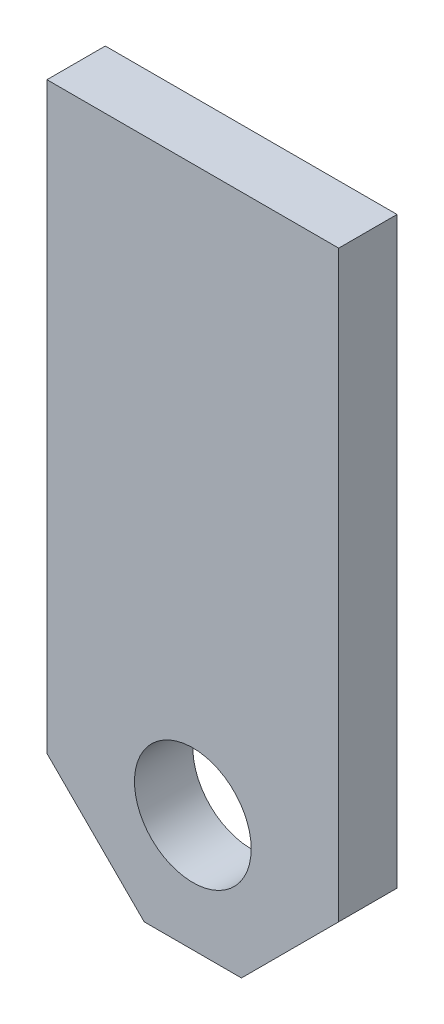
ISO-10303-21;
HEADER;
FILE_DESCRIPTION(('STEP AP214'),'2;1');
FILE_NAME('part.step','',(''),(''),'','','');
FILE_SCHEMA(('AUTOMOTIVE_DESIGN { 1 0 10303 214 1 1 1 1 }'));
ENDSEC;
DATA;
#1=APPLICATION_CONTEXT('core data for automotive mechanical design processes');
#2=APPLICATION_PROTOCOL_DEFINITION('international standard','automotive_design',2000,#1);
#3=PRODUCT_CONTEXT('',#1,'mechanical');
#4=PRODUCT('Part','Part','',(#3));
#5=PRODUCT_RELATED_PRODUCT_CATEGORY('part','',(#4));
#6=PRODUCT_DEFINITION_FORMATION('','',#4);
#7=PRODUCT_DEFINITION_CONTEXT('part definition',#1,'design');
#8=PRODUCT_DEFINITION('design','',#6,#7);
#9=PRODUCT_DEFINITION_SHAPE('','',#8);
#10=(LENGTH_UNIT() NAMED_UNIT(*) SI_UNIT(.MILLI.,.METRE.));
#11=(NAMED_UNIT(*) PLANE_ANGLE_UNIT() SI_UNIT($,.RADIAN.));
#12=(NAMED_UNIT(*) SI_UNIT($,.STERADIAN.) SOLID_ANGLE_UNIT());
#13=UNCERTAINTY_MEASURE_WITH_UNIT(LENGTH_MEASURE(1.E-05),#10,'distance_accuracy_value','');
#14=(GEOMETRIC_REPRESENTATION_CONTEXT(3) GLOBAL_UNCERTAINTY_ASSIGNED_CONTEXT((#13)) GLOBAL_UNIT_ASSIGNED_CONTEXT((#10,
#11,#12)) REPRESENTATION_CONTEXT('',''));
#15=CARTESIAN_POINT('',(0.,0.,0.));
#16=DIRECTION('',(0.,0.,1.));
#17=DIRECTION('',(1.,0.,0.));
#18=AXIS2_PLACEMENT_3D('',#15,#16,#17);
#19=CARTESIAN_POINT('',(-15.,0.,6.00000000000001));
#20=DIRECTION('',(-1.,0.,0.));
#21=DIRECTION('',(0.,-1.,0.));
#22=AXIS2_PLACEMENT_3D('',#19,#20,#21);
#23=PLANE('',#22);
#24=DIRECTION('',(0.,-1.,0.));
#25=VECTOR('',#24,1.);
#26=CARTESIAN_POINT('',(-15.,0.,6.00000000000001));
#27=LINE('',#26,#25);
#28=CARTESIAN_POINT('',(-15.,0.,6.00000000000001));
#29=VERTEX_POINT('',#28);
#30=CARTESIAN_POINT('',(-15.,-60.,6.00000000000001));
#31=VERTEX_POINT('',#30);
#32=EDGE_CURVE('E119',#29,#31,#27,.T.);
#33=ORIENTED_EDGE('',*,*,#32,.F.);
#34=DIRECTION('',(0.,0.,-1.));
#35=VECTOR('',#34,1.);
#36=CARTESIAN_POINT('',(-15.,0.,6.00000000000001));
#37=LINE('',#36,#35);
#38=CARTESIAN_POINT('',(-15.,0.,0.));
#39=VERTEX_POINT('',#38);
#40=EDGE_CURVE('E101',#29,#39,#37,.T.);
#41=ORIENTED_EDGE('',*,*,#40,.T.);
#42=DIRECTION('',(0.,-1.,0.));
#43=VECTOR('',#42,1.);
#44=CARTESIAN_POINT('',(-15.,0.,0.));
#45=LINE('',#44,#43);
#46=CARTESIAN_POINT('',(-15.,-60.,0.));
#47=VERTEX_POINT('',#46);
#48=EDGE_CURVE('E109',#39,#47,#45,.T.);
#49=ORIENTED_EDGE('',*,*,#48,.T.);
#50=DIRECTION('',(0.,0.,-1.));
#51=VECTOR('',#50,1.);
#52=CARTESIAN_POINT('',(-15.,-60.,6.00000000000001));
#53=LINE('',#52,#51);
#54=EDGE_CURVE('E120',#31,#47,#53,.T.);
#55=ORIENTED_EDGE('',*,*,#54,.F.);
#56=EDGE_LOOP('',(#33,#41,#49,#55));
#57=FACE_BOUND('',#56,.T.);
#58=ADVANCED_FACE('F35',(#57),#23,.T.);
#59=CARTESIAN_POINT('',(-15.,0.,6.00000000000001));
#60=DIRECTION('',(0.,-1.,0.));
#61=DIRECTION('',(0.,0.,1.));
#62=AXIS2_PLACEMENT_3D('',#59,#60,#61);
#63=PLANE('',#62);
#64=DIRECTION('',(1.,0.,0.));
#65=VECTOR('',#64,1.);
#66=CARTESIAN_POINT('',(-15.,0.,0.));
#67=LINE('',#66,#65);
#68=CARTESIAN_POINT('',(15.,0.,0.));
#69=VERTEX_POINT('',#68);
#70=EDGE_CURVE('E117',#39,#69,#67,.T.);
#71=ORIENTED_EDGE('',*,*,#70,.F.);
#72=ORIENTED_EDGE('',*,*,#40,.F.);
#73=DIRECTION('',(1.,0.,0.));
#74=VECTOR('',#73,1.);
#75=CARTESIAN_POINT('',(-15.,0.,6.00000000000001));
#76=LINE('',#75,#74);
#77=CARTESIAN_POINT('',(15.,0.,6.00000000000001));
#78=VERTEX_POINT('',#77);
#79=EDGE_CURVE('E88',#29,#78,#76,.T.);
#80=ORIENTED_EDGE('',*,*,#79,.T.);
#81=DIRECTION('',(0.,0.,-1.));
#82=VECTOR('',#81,1.);
#83=CARTESIAN_POINT('',(15.,0.,6.00000000000001));
#84=LINE('',#83,#82);
#85=EDGE_CURVE('E95',#78,#69,#84,.T.);
#86=ORIENTED_EDGE('',*,*,#85,.T.);
#87=EDGE_LOOP('',(#71,#72,#80,#86));
#88=FACE_BOUND('',#87,.T.);
#89=ADVANCED_FACE('F103',(#88),#63,.F.);
#90=CARTESIAN_POINT('',(15.,0.,6.00000000000001));
#91=DIRECTION('',(-1.,0.,0.));
#92=DIRECTION('',(0.,-1.,0.));
#93=AXIS2_PLACEMENT_3D('',#90,#91,#92);
#94=PLANE('',#93);
#95=DIRECTION('',(0.,-1.,0.));
#96=VECTOR('',#95,1.);
#97=CARTESIAN_POINT('',(15.,0.,0.));
#98=LINE('',#97,#96);
#99=CARTESIAN_POINT('',(15.,-60.,0.));
#100=VERTEX_POINT('',#99);
#101=EDGE_CURVE('E98',#69,#100,#98,.T.);
#102=ORIENTED_EDGE('',*,*,#101,.F.);
#103=ORIENTED_EDGE('',*,*,#85,.F.);
#104=DIRECTION('',(0.,-1.,0.));
#105=VECTOR('',#104,1.);
#106=CARTESIAN_POINT('',(15.,0.,6.00000000000001));
#107=LINE('',#106,#105);
#108=CARTESIAN_POINT('',(15.,-60.,6.00000000000001));
#109=VERTEX_POINT('',#108);
#110=EDGE_CURVE('E83',#78,#109,#107,.T.);
#111=ORIENTED_EDGE('',*,*,#110,.T.);
#112=DIRECTION('',(0.,0.,1.));
#113=VECTOR('',#112,1.);
#114=CARTESIAN_POINT('',(15.,-60.,6.00000000000001));
#115=LINE('',#114,#113);
#116=EDGE_CURVE('E11',#100,#109,#115,.T.);
#117=ORIENTED_EDGE('',*,*,#116,.F.);
#118=EDGE_LOOP('',(#102,#103,#111,#117));
#119=FACE_BOUND('',#118,.T.);
#120=ADVANCED_FACE('F96',(#119),#94,.F.);
#121=CARTESIAN_POINT('',(-15.,-70.,6.00000000000031));
#122=DIRECTION('',(0.,-1.,0.));
#123=DIRECTION('',(0.,0.,1.));
#124=AXIS2_PLACEMENT_3D('',#121,#122,#123);
#125=PLANE('',#124);
#126=DIRECTION('',(1.,0.,0.));
#127=VECTOR('',#126,1.);
#128=CARTESIAN_POINT('',(-15.,-70.,3.05311331771918E-13));
#129=LINE('',#128,#127);
#130=CARTESIAN_POINT('',(-4.99999999999989,-70.,3.05311331771918E-13));
#131=VERTEX_POINT('',#130);
#132=CARTESIAN_POINT('',(5.,-70.,3.05311331771918E-13));
#133=VERTEX_POINT('',#132);
#134=EDGE_CURVE('E112',#131,#133,#129,.T.);
#135=ORIENTED_EDGE('',*,*,#134,.T.);
#136=DIRECTION('',(0.,0.,-1.));
#137=VECTOR('',#136,1.);
#138=CARTESIAN_POINT('',(5.,-70.,3.05311331771918E-13));
#139=LINE('',#138,#137);
#140=CARTESIAN_POINT('',(5.,-70.,6.00000000000031));
#141=VERTEX_POINT('',#140);
#142=EDGE_CURVE('E128',#141,#133,#139,.T.);
#143=ORIENTED_EDGE('',*,*,#142,.F.);
#144=DIRECTION('',(1.,0.,0.));
#145=VECTOR('',#144,1.);
#146=CARTESIAN_POINT('',(-15.,-70.,6.00000000000031));
#147=LINE('',#146,#145);
#148=CARTESIAN_POINT('',(-4.99999999999989,-70.,6.00000000000031));
#149=VERTEX_POINT('',#148);
#150=EDGE_CURVE('E92',#149,#141,#147,.T.);
#151=ORIENTED_EDGE('',*,*,#150,.F.);
#152=DIRECTION('',(0.,0.,1.));
#153=VECTOR('',#152,1.);
#154=CARTESIAN_POINT('',(-4.99999999999989,-70.,6.00000000000031));
#155=LINE('',#154,#153);
#156=EDGE_CURVE('E130',#131,#149,#155,.T.);
#157=ORIENTED_EDGE('',*,*,#156,.F.);
#158=EDGE_LOOP('',(#135,#143,#151,#157));
#159=FACE_BOUND('',#158,.T.);
#160=ADVANCED_FACE('F153',(#159),#125,.T.);
#161=CARTESIAN_POINT('',(-15.,-70.,6.00000000000031));
#162=DIRECTION('',(0.,0.,-1.));
#163=DIRECTION('',(1.,0.,0.));
#164=AXIS2_PLACEMENT_3D('',#161,#162,#163);
#165=PLANE('',#164);
#166=CARTESIAN_POINT('',(0.,-58.,6.00000000000001));
#167=DIRECTION('',(0.,0.,1.));
#168=DIRECTION('',(1.,0.,0.));
#169=AXIS2_PLACEMENT_3D('',#166,#167,#168);
#170=CIRCLE('',#169,6.);
#171=CARTESIAN_POINT('',(6.,-58.,6.00000000000001));
#172=VERTEX_POINT('',#171);
#173=EDGE_CURVE('E113',#172,#172,#170,.T.);
#174=ORIENTED_EDGE('',*,*,#173,.F.);
#175=EDGE_LOOP('',(#174));
#176=FACE_BOUND('',#175,.T.);
#177=ORIENTED_EDGE('',*,*,#150,.T.);
#178=DIRECTION('',(-0.707106781186547,-0.707106781186549,0.));
#179=VECTOR('',#178,1.);
#180=CARTESIAN_POINT('',(5.,-70.,6.00000000000031));
#181=LINE('',#180,#179);
#182=EDGE_CURVE('E50',#109,#141,#181,.T.);
#183=ORIENTED_EDGE('',*,*,#182,.F.);
#184=ORIENTED_EDGE('',*,*,#110,.F.);
#185=ORIENTED_EDGE('',*,*,#79,.F.);
#186=ORIENTED_EDGE('',*,*,#32,.T.);
#187=DIRECTION('',(0.707106781186549,-0.707106781186546,0.));
#188=VECTOR('',#187,1.);
#189=CARTESIAN_POINT('',(-15.,-60.,6.00000000000001));
#190=LINE('',#189,#188);
#191=EDGE_CURVE('E43',#149,#31,#190,.F.);
#192=ORIENTED_EDGE('',*,*,#191,.F.);
#193=EDGE_LOOP('',(#177,#183,#184,#185,#186,#192));
#194=FACE_BOUND('',#193,.T.);
#195=ADVANCED_FACE('F85',(#176,#194),#165,.F.);
#196=CARTESIAN_POINT('',(-15.,-70.,3.05311331771918E-13));
#197=DIRECTION('',(0.,0.,-1.));
#198=DIRECTION('',(1.,0.,0.));
#199=AXIS2_PLACEMENT_3D('',#196,#197,#198);
#200=PLANE('',#199);
#201=CARTESIAN_POINT('',(0.,-58.,0.));
#202=DIRECTION('',(0.,0.,1.));
#203=DIRECTION('',(1.,0.,0.));
#204=AXIS2_PLACEMENT_3D('',#201,#202,#203);
#205=CIRCLE('',#204,6.);
#206=CARTESIAN_POINT('',(6.,-58.,0.));
#207=VERTEX_POINT('',#206);
#208=EDGE_CURVE('E142',#207,#207,#205,.T.);
#209=ORIENTED_EDGE('',*,*,#208,.T.);
#210=EDGE_LOOP('',(#209));
#211=FACE_BOUND('',#210,.T.);
#212=ORIENTED_EDGE('',*,*,#48,.F.);
#213=ORIENTED_EDGE('',*,*,#70,.T.);
#214=ORIENTED_EDGE('',*,*,#101,.T.);
#215=DIRECTION('',(0.707106781186547,0.707106781186549,0.));
#216=VECTOR('',#215,1.);
#217=CARTESIAN_POINT('',(-5.,-80.,3.05311331771918E-13));
#218=LINE('',#217,#216);
#219=EDGE_CURVE('E124',#133,#100,#218,.T.);
#220=ORIENTED_EDGE('',*,*,#219,.F.);
#221=ORIENTED_EDGE('',*,*,#134,.F.);
#222=DIRECTION('',(-0.707106781186549,0.707106781186546,0.));
#223=VECTOR('',#222,1.);
#224=CARTESIAN_POINT('',(-10.,-65.,1.94289029309402E-13));
#225=LINE('',#224,#223);
#226=EDGE_CURVE('E126',#47,#131,#225,.F.);
#227=ORIENTED_EDGE('',*,*,#226,.F.);
#228=EDGE_LOOP('',(#212,#213,#214,#220,#221,#227));
#229=FACE_BOUND('',#228,.T.);
#230=ADVANCED_FACE('F152',(#211,#229),#200,.T.);
#231=CARTESIAN_POINT('',(-15.,-60.,6.00000000000001));
#232=DIRECTION('',(0.707106781186546,0.707106781186549,0.));
#233=DIRECTION('',(-0.707106781186549,0.707106781186546,0.));
#234=AXIS2_PLACEMENT_3D('',#231,#232,#233);
#235=PLANE('',#234);
#236=ORIENTED_EDGE('',*,*,#191,.T.);
#237=ORIENTED_EDGE('',*,*,#54,.T.);
#238=ORIENTED_EDGE('',*,*,#226,.T.);
#239=ORIENTED_EDGE('',*,*,#156,.T.);
#240=EDGE_LOOP('',(#236,#237,#238,#239));
#241=FACE_BOUND('',#240,.T.);
#242=ADVANCED_FACE('F135',(#241),#235,.F.);
#243=CARTESIAN_POINT('',(5.,-70.,6.00000000000031));
#244=DIRECTION('',(0.707106781186548,-0.707106781186546,0.));
#245=DIRECTION('',(0.707106781186547,0.707106781186549,0.));
#246=AXIS2_PLACEMENT_3D('',#243,#244,#245);
#247=PLANE('',#246);
#248=ORIENTED_EDGE('',*,*,#182,.T.);
#249=ORIENTED_EDGE('',*,*,#142,.T.);
#250=ORIENTED_EDGE('',*,*,#219,.T.);
#251=ORIENTED_EDGE('',*,*,#116,.T.);
#252=EDGE_LOOP('',(#248,#249,#250,#251));
#253=FACE_BOUND('',#252,.T.);
#254=ADVANCED_FACE('F37',(#253),#247,.T.);
#255=CARTESIAN_POINT('',(0.,-58.,6.00000000000001));
#256=DIRECTION('',(0.,0.,-1.));
#257=DIRECTION('',(1.,0.,0.));
#258=AXIS2_PLACEMENT_3D('',#255,#256,#257);
#259=CYLINDRICAL_SURFACE('',#258,6.);
#260=ORIENTED_EDGE('',*,*,#173,.T.);
#261=EDGE_LOOP('',(#260));
#262=FACE_BOUND('',#261,.T.);
#263=ORIENTED_EDGE('',*,*,#208,.F.);
#264=EDGE_LOOP('',(#263));
#265=FACE_BOUND('',#264,.T.);
#266=ADVANCED_FACE('F148',(#262,#265),#259,.F.);
#267=CLOSED_SHELL('',(#58,#89,#120,#160,#195,#230,#242,#254,#266));
#268=MANIFOLD_SOLID_BREP('B2',#267);
#269=ADVANCED_BREP_SHAPE_REPRESENTATION('',(#18,#268),#14);
#270=SHAPE_DEFINITION_REPRESENTATION(#9,#269);
ENDSEC;
END-ISO-10303-21;
